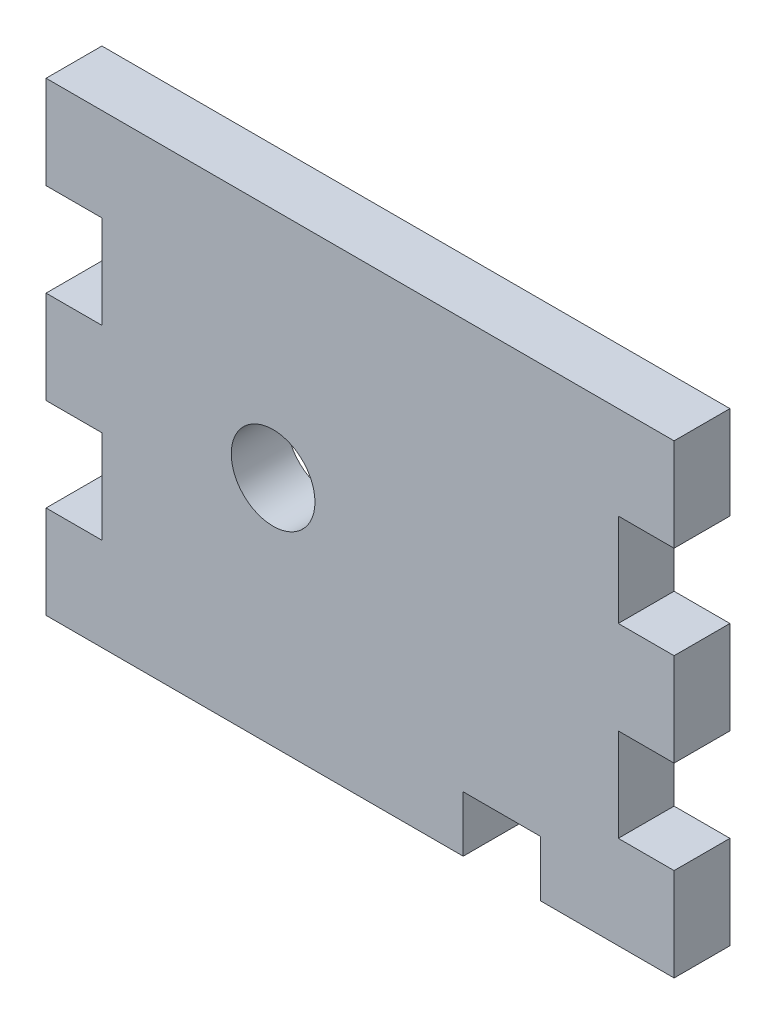
ISO-10303-21;
HEADER;
FILE_DESCRIPTION(('STEP AP214'),'2;1');
FILE_NAME('part.step','',(''),(''),'','','');
FILE_SCHEMA(('AUTOMOTIVE_DESIGN { 1 0 10303 214 1 1 1 1 }'));
ENDSEC;
DATA;
#1=APPLICATION_CONTEXT('core data for automotive mechanical design processes');
#2=APPLICATION_PROTOCOL_DEFINITION('international standard','automotive_design',2000,#1);
#3=PRODUCT_CONTEXT('',#1,'mechanical');
#4=PRODUCT('Part','Part','',(#3));
#5=PRODUCT_RELATED_PRODUCT_CATEGORY('part','',(#4));
#6=PRODUCT_DEFINITION_FORMATION('','',#4);
#7=PRODUCT_DEFINITION_CONTEXT('part definition',#1,'design');
#8=PRODUCT_DEFINITION('design','',#6,#7);
#9=PRODUCT_DEFINITION_SHAPE('','',#8);
#10=(LENGTH_UNIT() NAMED_UNIT(*) SI_UNIT(.MILLI.,.METRE.));
#11=(NAMED_UNIT(*) PLANE_ANGLE_UNIT() SI_UNIT($,.RADIAN.));
#12=(NAMED_UNIT(*) SI_UNIT($,.STERADIAN.) SOLID_ANGLE_UNIT());
#13=UNCERTAINTY_MEASURE_WITH_UNIT(LENGTH_MEASURE(1.E-05),#10,'distance_accuracy_value','');
#14=(GEOMETRIC_REPRESENTATION_CONTEXT(3) GLOBAL_UNCERTAINTY_ASSIGNED_CONTEXT((#13)) GLOBAL_UNIT_ASSIGNED_CONTEXT((#10,
#11,#12)) REPRESENTATION_CONTEXT('',''));
#15=CARTESIAN_POINT('',(0.,0.,0.));
#16=DIRECTION('',(0.,0.,1.));
#17=DIRECTION('',(1.,0.,0.));
#18=AXIS2_PLACEMENT_3D('',#15,#16,#17);
#19=CARTESIAN_POINT('',(0.,0.,15.24));
#20=DIRECTION('',(0.,1.,0.));
#21=DIRECTION('',(0.,0.,1.));
#22=AXIS2_PLACEMENT_3D('',#19,#20,#21);
#23=PLANE('',#22);
#24=DIRECTION('',(1.,0.,0.));
#25=VECTOR('',#24,1.);
#26=CARTESIAN_POINT('',(0.,0.,0.));
#27=LINE('',#26,#25);
#28=CARTESIAN_POINT('',(0.,0.,0.));
#29=VERTEX_POINT('',#28);
#30=CARTESIAN_POINT('',(113.876666666667,0.,0.));
#31=VERTEX_POINT('',#30);
#32=EDGE_CURVE('E211',#29,#31,#27,.T.);
#33=ORIENTED_EDGE('',*,*,#32,.T.);
#34=DIRECTION('',(0.,0.,1.));
#35=VECTOR('',#34,1.);
#36=CARTESIAN_POINT('',(113.876666666667,0.,0.));
#37=LINE('',#36,#35);
#38=CARTESIAN_POINT('',(113.876666666667,0.,15.24));
#39=VERTEX_POINT('',#38);
#40=EDGE_CURVE('E194',#31,#39,#37,.T.);
#41=ORIENTED_EDGE('',*,*,#40,.T.);
#42=DIRECTION('',(1.,0.,0.));
#43=VECTOR('',#42,1.);
#44=CARTESIAN_POINT('',(0.,0.,15.24));
#45=LINE('',#44,#43);
#46=CARTESIAN_POINT('',(0.,0.,15.24));
#47=VERTEX_POINT('',#46);
#48=EDGE_CURVE('E360',#47,#39,#45,.T.);
#49=ORIENTED_EDGE('',*,*,#48,.F.);
#50=DIRECTION('',(0.,0.,-1.));
#51=VECTOR('',#50,1.);
#52=CARTESIAN_POINT('',(0.,0.,15.24));
#53=LINE('',#52,#51);
#54=EDGE_CURVE('E11',#47,#29,#53,.T.);
#55=ORIENTED_EDGE('',*,*,#54,.T.);
#56=EDGE_LOOP('',(#33,#41,#49,#55));
#57=FACE_BOUND('',#56,.T.);
#58=ADVANCED_FACE('F33',(#57),#23,.F.);
#59=CARTESIAN_POINT('',(0.,0.,15.24));
#60=DIRECTION('',(1.,0.,0.));
#61=DIRECTION('',(0.,0.,-1.));
#62=AXIS2_PLACEMENT_3D('',#59,#60,#61);
#63=PLANE('',#62);
#64=DIRECTION('',(0.,-1.,0.));
#65=VECTOR('',#64,1.);
#66=CARTESIAN_POINT('',(0.,0.,0.));
#67=LINE('',#66,#65);
#68=CARTESIAN_POINT('',(0.,76.2,0.));
#69=VERTEX_POINT('',#68);
#70=CARTESIAN_POINT('',(0.,50.8,0.));
#71=VERTEX_POINT('',#70);
#72=EDGE_CURVE('E403',#69,#71,#67,.T.);
#73=ORIENTED_EDGE('',*,*,#72,.T.);
#74=DIRECTION('',(0.,0.,1.));
#75=VECTOR('',#74,1.);
#76=CARTESIAN_POINT('',(0.,50.8,0.));
#77=LINE('',#76,#75);
#78=CARTESIAN_POINT('',(0.,50.8,15.24));
#79=VERTEX_POINT('',#78);
#80=EDGE_CURVE('E296',#71,#79,#77,.T.);
#81=ORIENTED_EDGE('',*,*,#80,.T.);
#82=DIRECTION('',(0.,-1.,0.));
#83=VECTOR('',#82,1.);
#84=CARTESIAN_POINT('',(0.,0.,15.24));
#85=LINE('',#84,#83);
#86=CARTESIAN_POINT('',(0.,76.2,15.24));
#87=VERTEX_POINT('',#86);
#88=EDGE_CURVE('E359',#87,#79,#85,.T.);
#89=ORIENTED_EDGE('',*,*,#88,.F.);
#90=DIRECTION('',(0.,0.,1.));
#91=VECTOR('',#90,1.);
#92=CARTESIAN_POINT('',(0.,76.2,0.));
#93=LINE('',#92,#91);
#94=EDGE_CURVE('E339',#69,#87,#93,.T.);
#95=ORIENTED_EDGE('',*,*,#94,.F.);
#96=EDGE_LOOP('',(#73,#81,#89,#95));
#97=FACE_BOUND('',#96,.T.);
#98=ADVANCED_FACE('F397',(#97),#63,.F.);
#99=CARTESIAN_POINT('',(0.,127.,0.));
#100=VERTEX_POINT('',#99);
#101=CARTESIAN_POINT('',(0.,101.6,0.));
#102=VERTEX_POINT('',#101);
#103=EDGE_CURVE('E223',#100,#102,#67,.T.);
#104=ORIENTED_EDGE('',*,*,#103,.T.);
#105=DIRECTION('',(0.,0.,1.));
#106=VECTOR('',#105,1.);
#107=CARTESIAN_POINT('',(0.,101.6,0.));
#108=LINE('',#107,#106);
#109=CARTESIAN_POINT('',(0.,101.6,15.24));
#110=VERTEX_POINT('',#109);
#111=EDGE_CURVE('E346',#102,#110,#108,.T.);
#112=ORIENTED_EDGE('',*,*,#111,.T.);
#113=CARTESIAN_POINT('',(0.,127.,15.24));
#114=VERTEX_POINT('',#113);
#115=EDGE_CURVE('E355',#114,#110,#85,.T.);
#116=ORIENTED_EDGE('',*,*,#115,.F.);
#117=DIRECTION('',(0.,0.,-1.));
#118=VECTOR('',#117,1.);
#119=CARTESIAN_POINT('',(0.,127.,15.24));
#120=LINE('',#119,#118);
#121=EDGE_CURVE('E231',#114,#100,#120,.T.);
#122=ORIENTED_EDGE('',*,*,#121,.T.);
#123=EDGE_LOOP('',(#104,#112,#116,#122));
#124=FACE_BOUND('',#123,.T.);
#125=ADVANCED_FACE('F379',(#124),#63,.F.);
#126=CARTESIAN_POINT('',(171.45,0.,15.24));
#127=DIRECTION('',(-1.,0.,0.));
#128=DIRECTION('',(0.,-1.,0.));
#129=AXIS2_PLACEMENT_3D('',#126,#127,#128);
#130=PLANE('',#129);
#131=DIRECTION('',(0.,1.,0.));
#132=VECTOR('',#131,1.);
#133=CARTESIAN_POINT('',(171.45,0.,0.));
#134=LINE('',#133,#132);
#135=CARTESIAN_POINT('',(171.45,50.8,0.));
#136=VERTEX_POINT('',#135);
#137=CARTESIAN_POINT('',(171.45,76.2,0.));
#138=VERTEX_POINT('',#137);
#139=EDGE_CURVE('E220',#136,#138,#134,.T.);
#140=ORIENTED_EDGE('',*,*,#139,.T.);
#141=DIRECTION('',(0.,0.,1.));
#142=VECTOR('',#141,1.);
#143=CARTESIAN_POINT('',(171.45,76.2,0.));
#144=LINE('',#143,#142);
#145=CARTESIAN_POINT('',(171.45,76.2,15.24));
#146=VERTEX_POINT('',#145);
#147=EDGE_CURVE('E292',#138,#146,#144,.T.);
#148=ORIENTED_EDGE('',*,*,#147,.T.);
#149=DIRECTION('',(0.,1.,0.));
#150=VECTOR('',#149,1.);
#151=CARTESIAN_POINT('',(171.45,0.,15.24));
#152=LINE('',#151,#150);
#153=CARTESIAN_POINT('',(171.45,50.8,15.24));
#154=VERTEX_POINT('',#153);
#155=EDGE_CURVE('E363',#154,#146,#152,.T.);
#156=ORIENTED_EDGE('',*,*,#155,.F.);
#157=DIRECTION('',(0.,0.,1.));
#158=VECTOR('',#157,1.);
#159=CARTESIAN_POINT('',(171.45,50.8,0.));
#160=LINE('',#159,#158);
#161=EDGE_CURVE('E256',#136,#154,#160,.T.);
#162=ORIENTED_EDGE('',*,*,#161,.F.);
#163=EDGE_LOOP('',(#140,#148,#156,#162));
#164=FACE_BOUND('',#163,.T.);
#165=ADVANCED_FACE('F434',(#164),#130,.F.);
#166=CARTESIAN_POINT('',(171.45,0.,0.));
#167=VERTEX_POINT('',#166);
#168=CARTESIAN_POINT('',(171.45,25.4,0.));
#169=VERTEX_POINT('',#168);
#170=EDGE_CURVE('E222',#167,#169,#134,.T.);
#171=ORIENTED_EDGE('',*,*,#170,.T.);
#172=DIRECTION('',(0.,0.,1.));
#173=VECTOR('',#172,1.);
#174=CARTESIAN_POINT('',(171.45,25.4,0.));
#175=LINE('',#174,#173);
#176=CARTESIAN_POINT('',(171.45,25.4,15.24));
#177=VERTEX_POINT('',#176);
#178=EDGE_CURVE('E273',#169,#177,#175,.T.);
#179=ORIENTED_EDGE('',*,*,#178,.T.);
#180=CARTESIAN_POINT('',(171.45,0.,15.24));
#181=VERTEX_POINT('',#180);
#182=EDGE_CURVE('E245',#181,#177,#152,.T.);
#183=ORIENTED_EDGE('',*,*,#182,.F.);
#184=DIRECTION('',(0.,0.,-1.));
#185=VECTOR('',#184,1.);
#186=CARTESIAN_POINT('',(171.45,0.,15.24));
#187=LINE('',#186,#185);
#188=EDGE_CURVE('E41',#181,#167,#187,.T.);
#189=ORIENTED_EDGE('',*,*,#188,.T.);
#190=EDGE_LOOP('',(#171,#179,#183,#189));
#191=FACE_BOUND('',#190,.T.);
#192=ADVANCED_FACE('F242',(#191),#130,.F.);
#193=CARTESIAN_POINT('',(0.,25.4,15.24));
#194=VERTEX_POINT('',#193);
#195=EDGE_CURVE('E230',#194,#47,#85,.T.);
#196=ORIENTED_EDGE('',*,*,#195,.F.);
#197=DIRECTION('',(0.,0.,1.));
#198=VECTOR('',#197,1.);
#199=CARTESIAN_POINT('',(0.,25.4,0.));
#200=LINE('',#199,#198);
#201=CARTESIAN_POINT('',(0.,25.4,0.));
#202=VERTEX_POINT('',#201);
#203=EDGE_CURVE('E287',#202,#194,#200,.T.);
#204=ORIENTED_EDGE('',*,*,#203,.F.);
#205=EDGE_CURVE('E349',#202,#29,#67,.T.);
#206=ORIENTED_EDGE('',*,*,#205,.T.);
#207=ORIENTED_EDGE('',*,*,#54,.F.);
#208=EDGE_LOOP('',(#196,#204,#206,#207));
#209=FACE_BOUND('',#208,.T.);
#210=ADVANCED_FACE('F35',(#209),#63,.F.);
#211=CARTESIAN_POINT('',(135.043333333333,0.,15.24));
#212=VERTEX_POINT('',#211);
#213=EDGE_CURVE('E358',#212,#181,#45,.T.);
#214=ORIENTED_EDGE('',*,*,#213,.F.);
#215=DIRECTION('',(0.,0.,1.));
#216=VECTOR('',#215,1.);
#217=CARTESIAN_POINT('',(135.043333333333,0.,0.));
#218=LINE('',#217,#216);
#219=CARTESIAN_POINT('',(135.043333333333,0.,0.));
#220=VERTEX_POINT('',#219);
#221=EDGE_CURVE('E204',#220,#212,#218,.T.);
#222=ORIENTED_EDGE('',*,*,#221,.F.);
#223=EDGE_CURVE('E218',#220,#167,#27,.T.);
#224=ORIENTED_EDGE('',*,*,#223,.T.);
#225=ORIENTED_EDGE('',*,*,#188,.F.);
#226=EDGE_LOOP('',(#214,#222,#224,#225));
#227=FACE_BOUND('',#226,.T.);
#228=ADVANCED_FACE('F422',(#227),#23,.F.);
#229=CARTESIAN_POINT('',(171.45,101.6,15.24));
#230=VERTEX_POINT('',#229);
#231=CARTESIAN_POINT('',(171.45,127.,15.24));
#232=VERTEX_POINT('',#231);
#233=EDGE_CURVE('E362',#230,#232,#152,.T.);
#234=ORIENTED_EDGE('',*,*,#233,.F.);
#235=DIRECTION('',(0.,0.,1.));
#236=VECTOR('',#235,1.);
#237=CARTESIAN_POINT('',(171.45,101.6,0.));
#238=LINE('',#237,#236);
#239=CARTESIAN_POINT('',(171.45,101.6,0.));
#240=VERTEX_POINT('',#239);
#241=EDGE_CURVE('E315',#240,#230,#238,.T.);
#242=ORIENTED_EDGE('',*,*,#241,.F.);
#243=CARTESIAN_POINT('',(171.45,127.,0.));
#244=VERTEX_POINT('',#243);
#245=EDGE_CURVE('E217',#240,#244,#134,.T.);
#246=ORIENTED_EDGE('',*,*,#245,.T.);
#247=DIRECTION('',(0.,0.,-1.));
#248=VECTOR('',#247,1.);
#249=CARTESIAN_POINT('',(171.45,127.,15.24));
#250=LINE('',#249,#248);
#251=EDGE_CURVE('E234',#232,#244,#250,.T.);
#252=ORIENTED_EDGE('',*,*,#251,.F.);
#253=EDGE_LOOP('',(#234,#242,#246,#252));
#254=FACE_BOUND('',#253,.T.);
#255=ADVANCED_FACE('F428',(#254),#130,.F.);
#256=CARTESIAN_POINT('',(0.,127.,15.24));
#257=DIRECTION('',(0.,-1.,0.));
#258=DIRECTION('',(0.,0.,-1.));
#259=AXIS2_PLACEMENT_3D('',#256,#257,#258);
#260=PLANE('',#259);
#261=DIRECTION('',(-1.,0.,0.));
#262=VECTOR('',#261,1.);
#263=CARTESIAN_POINT('',(0.,127.,0.));
#264=LINE('',#263,#262);
#265=EDGE_CURVE('E228',#244,#100,#264,.T.);
#266=ORIENTED_EDGE('',*,*,#265,.T.);
#267=ORIENTED_EDGE('',*,*,#121,.F.);
#268=DIRECTION('',(-1.,0.,0.));
#269=VECTOR('',#268,1.);
#270=CARTESIAN_POINT('',(0.,127.,15.24));
#271=LINE('',#270,#269);
#272=EDGE_CURVE('E235',#232,#114,#271,.T.);
#273=ORIENTED_EDGE('',*,*,#272,.F.);
#274=ORIENTED_EDGE('',*,*,#251,.T.);
#275=EDGE_LOOP('',(#266,#267,#273,#274));
#276=FACE_BOUND('',#275,.T.);
#277=ADVANCED_FACE('F374',(#276),#260,.F.);
#278=CARTESIAN_POINT('',(0.,0.,15.24));
#279=DIRECTION('',(0.,0.,-1.));
#280=DIRECTION('',(-1.,0.,0.));
#281=AXIS2_PLACEMENT_3D('',#278,#279,#280);
#282=PLANE('',#281);
#283=CARTESIAN_POINT('',(61.976,63.5,15.24));
#284=DIRECTION('',(0.,0.,1.));
#285=DIRECTION('',(1.,0.,0.));
#286=AXIS2_PLACEMENT_3D('',#283,#284,#285);
#287=CIRCLE('',#286,11.43);
#288=CARTESIAN_POINT('',(73.406,63.5,15.24));
#289=VERTEX_POINT('',#288);
#290=EDGE_CURVE('E450',#289,#289,#287,.T.);
#291=ORIENTED_EDGE('',*,*,#290,.F.);
#292=EDGE_LOOP('',(#291));
#293=FACE_BOUND('',#292,.T.);
#294=ORIENTED_EDGE('',*,*,#48,.T.);
#295=DIRECTION('',(0.,-1.,0.));
#296=VECTOR('',#295,1.);
#297=CARTESIAN_POINT('',(113.876666666667,0.,15.24));
#298=LINE('',#297,#296);
#299=CARTESIAN_POINT('',(113.876666666667,15.24,15.24));
#300=VERTEX_POINT('',#299);
#301=EDGE_CURVE('E199',#300,#39,#298,.T.);
#302=ORIENTED_EDGE('',*,*,#301,.F.);
#303=DIRECTION('',(-1.,0.,0.));
#304=VECTOR('',#303,1.);
#305=CARTESIAN_POINT('',(113.876666666667,15.24,15.24));
#306=LINE('',#305,#304);
#307=CARTESIAN_POINT('',(135.043333333333,15.24,15.24));
#308=VERTEX_POINT('',#307);
#309=EDGE_CURVE('E214',#308,#300,#306,.T.);
#310=ORIENTED_EDGE('',*,*,#309,.F.);
#311=DIRECTION('',(0.,1.,0.));
#312=VECTOR('',#311,1.);
#313=CARTESIAN_POINT('',(135.043333333333,0.,15.24));
#314=LINE('',#313,#312);
#315=EDGE_CURVE('E440',#212,#308,#314,.T.);
#316=ORIENTED_EDGE('',*,*,#315,.F.);
#317=ORIENTED_EDGE('',*,*,#213,.T.);
#318=ORIENTED_EDGE('',*,*,#182,.T.);
#319=DIRECTION('',(1.,0.,0.));
#320=VECTOR('',#319,1.);
#321=CARTESIAN_POINT('',(171.45,25.4,15.24));
#322=LINE('',#321,#320);
#323=CARTESIAN_POINT('',(156.21,25.4,15.24));
#324=VERTEX_POINT('',#323);
#325=EDGE_CURVE('E271',#324,#177,#322,.T.);
#326=ORIENTED_EDGE('',*,*,#325,.F.);
#327=DIRECTION('',(0.,-1.,0.));
#328=VECTOR('',#327,1.);
#329=CARTESIAN_POINT('',(156.21,50.8,15.24));
#330=LINE('',#329,#328);
#331=CARTESIAN_POINT('',(156.21,50.8,15.24));
#332=VERTEX_POINT('',#331);
#333=EDGE_CURVE('E267',#332,#324,#330,.T.);
#334=ORIENTED_EDGE('',*,*,#333,.F.);
#335=DIRECTION('',(-1.,0.,0.));
#336=VECTOR('',#335,1.);
#337=CARTESIAN_POINT('',(171.45,50.8,15.24));
#338=LINE('',#337,#336);
#339=EDGE_CURVE('E264',#154,#332,#338,.T.);
#340=ORIENTED_EDGE('',*,*,#339,.F.);
#341=ORIENTED_EDGE('',*,*,#155,.T.);
#342=DIRECTION('',(1.,0.,0.));
#343=VECTOR('',#342,1.);
#344=CARTESIAN_POINT('',(171.45,76.2,15.24));
#345=LINE('',#344,#343);
#346=CARTESIAN_POINT('',(156.21,76.2,15.24));
#347=VERTEX_POINT('',#346);
#348=EDGE_CURVE('E309',#347,#146,#345,.T.);
#349=ORIENTED_EDGE('',*,*,#348,.F.);
#350=DIRECTION('',(0.,-1.,0.));
#351=VECTOR('',#350,1.);
#352=CARTESIAN_POINT('',(156.21,101.6,15.24));
#353=LINE('',#352,#351);
#354=CARTESIAN_POINT('',(156.21,101.6,15.24));
#355=VERTEX_POINT('',#354);
#356=EDGE_CURVE('E318',#355,#347,#353,.T.);
#357=ORIENTED_EDGE('',*,*,#356,.F.);
#358=DIRECTION('',(-1.,0.,0.));
#359=VECTOR('',#358,1.);
#360=CARTESIAN_POINT('',(171.45,101.6,15.24));
#361=LINE('',#360,#359);
#362=EDGE_CURVE('E275',#230,#355,#361,.T.);
#363=ORIENTED_EDGE('',*,*,#362,.F.);
#364=ORIENTED_EDGE('',*,*,#233,.T.);
#365=ORIENTED_EDGE('',*,*,#272,.T.);
#366=ORIENTED_EDGE('',*,*,#115,.T.);
#367=DIRECTION('',(-1.,0.,0.));
#368=VECTOR('',#367,1.);
#369=CARTESIAN_POINT('',(0.,101.6,15.24));
#370=LINE('',#369,#368);
#371=CARTESIAN_POINT('',(15.24,101.6,15.24));
#372=VERTEX_POINT('',#371);
#373=EDGE_CURVE('E333',#372,#110,#370,.T.);
#374=ORIENTED_EDGE('',*,*,#373,.F.);
#375=DIRECTION('',(0.,1.,0.));
#376=VECTOR('',#375,1.);
#377=CARTESIAN_POINT('',(15.24,101.6,15.24));
#378=LINE('',#377,#376);
#379=CARTESIAN_POINT('',(15.24,76.2,15.24));
#380=VERTEX_POINT('',#379);
#381=EDGE_CURVE('E342',#380,#372,#378,.T.);
#382=ORIENTED_EDGE('',*,*,#381,.F.);
#383=DIRECTION('',(1.,0.,0.));
#384=VECTOR('',#383,1.);
#385=CARTESIAN_POINT('',(0.,76.2,15.24));
#386=LINE('',#385,#384);
#387=EDGE_CURVE('E299',#87,#380,#386,.T.);
#388=ORIENTED_EDGE('',*,*,#387,.F.);
#389=ORIENTED_EDGE('',*,*,#88,.T.);
#390=DIRECTION('',(-1.,0.,0.));
#391=VECTOR('',#390,1.);
#392=CARTESIAN_POINT('',(0.,50.8,15.24));
#393=LINE('',#392,#391);
#394=CARTESIAN_POINT('',(15.24,50.8,15.24));
#395=VERTEX_POINT('',#394);
#396=EDGE_CURVE('E282',#395,#79,#393,.T.);
#397=ORIENTED_EDGE('',*,*,#396,.F.);
#398=DIRECTION('',(0.,1.,0.));
#399=VECTOR('',#398,1.);
#400=CARTESIAN_POINT('',(15.24,50.8,15.24));
#401=LINE('',#400,#399);
#402=CARTESIAN_POINT('',(15.24,25.4,15.24));
#403=VERTEX_POINT('',#402);
#404=EDGE_CURVE('E291',#403,#395,#401,.T.);
#405=ORIENTED_EDGE('',*,*,#404,.F.);
#406=DIRECTION('',(1.,0.,0.));
#407=VECTOR('',#406,1.);
#408=CARTESIAN_POINT('',(0.,25.4,15.24));
#409=LINE('',#408,#407);
#410=EDGE_CURVE('E288',#194,#403,#409,.T.);
#411=ORIENTED_EDGE('',*,*,#410,.F.);
#412=ORIENTED_EDGE('',*,*,#195,.T.);
#413=EDGE_LOOP('',(#294,#302,#310,#316,#317,#318,#326,#334,#340,#341,#349,#357,#363,#364,#365,
#366,#374,#382,#388,#389,#397,#405,#411,#412));
#414=FACE_BOUND('',#413,.T.);
#415=ADVANCED_FACE('F367',(#293,#414),#282,.F.);
#416=CARTESIAN_POINT('',(0.,0.,0.));
#417=DIRECTION('',(0.,0.,-1.));
#418=DIRECTION('',(-1.,0.,0.));
#419=AXIS2_PLACEMENT_3D('',#416,#417,#418);
#420=PLANE('',#419);
#421=DIRECTION('',(0.,-1.,0.));
#422=VECTOR('',#421,1.);
#423=CARTESIAN_POINT('',(113.876666666667,0.,0.));
#424=LINE('',#423,#422);
#425=CARTESIAN_POINT('',(113.876666666667,15.24,0.));
#426=VERTEX_POINT('',#425);
#427=EDGE_CURVE('E197',#426,#31,#424,.T.);
#428=ORIENTED_EDGE('',*,*,#427,.T.);
#429=ORIENTED_EDGE('',*,*,#32,.F.);
#430=ORIENTED_EDGE('',*,*,#205,.F.);
#431=DIRECTION('',(1.,0.,0.));
#432=VECTOR('',#431,1.);
#433=CARTESIAN_POINT('',(0.,25.4,0.));
#434=LINE('',#433,#432);
#435=CARTESIAN_POINT('',(15.24,25.4,0.));
#436=VERTEX_POINT('',#435);
#437=EDGE_CURVE('E279',#202,#436,#434,.T.);
#438=ORIENTED_EDGE('',*,*,#437,.T.);
#439=DIRECTION('',(0.,1.,0.));
#440=VECTOR('',#439,1.);
#441=CARTESIAN_POINT('',(15.24,50.8,0.));
#442=LINE('',#441,#440);
#443=CARTESIAN_POINT('',(15.24,50.8,0.));
#444=VERTEX_POINT('',#443);
#445=EDGE_CURVE('E56',#436,#444,#442,.T.);
#446=ORIENTED_EDGE('',*,*,#445,.T.);
#447=DIRECTION('',(-1.,0.,0.));
#448=VECTOR('',#447,1.);
#449=CARTESIAN_POINT('',(0.,50.8,0.));
#450=LINE('',#449,#448);
#451=EDGE_CURVE('E284',#444,#71,#450,.T.);
#452=ORIENTED_EDGE('',*,*,#451,.T.);
#453=ORIENTED_EDGE('',*,*,#72,.F.);
#454=DIRECTION('',(1.,0.,0.));
#455=VECTOR('',#454,1.);
#456=CARTESIAN_POINT('',(0.,76.2,0.));
#457=LINE('',#456,#455);
#458=CARTESIAN_POINT('',(15.24,76.2,0.));
#459=VERTEX_POINT('',#458);
#460=EDGE_CURVE('E329',#69,#459,#457,.T.);
#461=ORIENTED_EDGE('',*,*,#460,.T.);
#462=DIRECTION('',(0.,1.,0.));
#463=VECTOR('',#462,1.);
#464=CARTESIAN_POINT('',(15.24,101.6,0.));
#465=LINE('',#464,#463);
#466=CARTESIAN_POINT('',(15.24,101.6,0.));
#467=VERTEX_POINT('',#466);
#468=EDGE_CURVE('E332',#459,#467,#465,.T.);
#469=ORIENTED_EDGE('',*,*,#468,.T.);
#470=DIRECTION('',(-1.,0.,0.));
#471=VECTOR('',#470,1.);
#472=CARTESIAN_POINT('',(0.,101.6,0.));
#473=LINE('',#472,#471);
#474=EDGE_CURVE('E336',#467,#102,#473,.T.);
#475=ORIENTED_EDGE('',*,*,#474,.T.);
#476=ORIENTED_EDGE('',*,*,#103,.F.);
#477=ORIENTED_EDGE('',*,*,#265,.F.);
#478=ORIENTED_EDGE('',*,*,#245,.F.);
#479=DIRECTION('',(-1.,0.,0.));
#480=VECTOR('',#479,1.);
#481=CARTESIAN_POINT('',(171.45,101.6,0.));
#482=LINE('',#481,#480);
#483=CARTESIAN_POINT('',(156.21,101.6,0.));
#484=VERTEX_POINT('',#483);
#485=EDGE_CURVE('E305',#240,#484,#482,.T.);
#486=ORIENTED_EDGE('',*,*,#485,.T.);
#487=DIRECTION('',(0.,-1.,0.));
#488=VECTOR('',#487,1.);
#489=CARTESIAN_POINT('',(156.21,101.6,0.));
#490=LINE('',#489,#488);
#491=CARTESIAN_POINT('',(156.21,76.2,0.));
#492=VERTEX_POINT('',#491);
#493=EDGE_CURVE('E308',#484,#492,#490,.T.);
#494=ORIENTED_EDGE('',*,*,#493,.T.);
#495=DIRECTION('',(1.,0.,0.));
#496=VECTOR('',#495,1.);
#497=CARTESIAN_POINT('',(171.45,76.2,0.));
#498=LINE('',#497,#496);
#499=EDGE_CURVE('E312',#492,#138,#498,.T.);
#500=ORIENTED_EDGE('',*,*,#499,.T.);
#501=ORIENTED_EDGE('',*,*,#139,.F.);
#502=DIRECTION('',(-1.,0.,0.));
#503=VECTOR('',#502,1.);
#504=CARTESIAN_POINT('',(171.45,50.8,0.));
#505=LINE('',#504,#503);
#506=CARTESIAN_POINT('',(156.21,50.8,0.));
#507=VERTEX_POINT('',#506);
#508=EDGE_CURVE('E260',#136,#507,#505,.T.);
#509=ORIENTED_EDGE('',*,*,#508,.T.);
#510=DIRECTION('',(0.,-1.,0.));
#511=VECTOR('',#510,1.);
#512=CARTESIAN_POINT('',(156.21,50.8,0.));
#513=LINE('',#512,#511);
#514=CARTESIAN_POINT('',(156.21,25.4,0.));
#515=VERTEX_POINT('',#514);
#516=EDGE_CURVE('E254',#507,#515,#513,.T.);
#517=ORIENTED_EDGE('',*,*,#516,.T.);
#518=DIRECTION('',(1.,0.,0.));
#519=VECTOR('',#518,1.);
#520=CARTESIAN_POINT('',(171.45,25.4,0.));
#521=LINE('',#520,#519);
#522=EDGE_CURVE('E252',#515,#169,#521,.T.);
#523=ORIENTED_EDGE('',*,*,#522,.T.);
#524=ORIENTED_EDGE('',*,*,#170,.F.);
#525=ORIENTED_EDGE('',*,*,#223,.F.);
#526=DIRECTION('',(0.,1.,0.));
#527=VECTOR('',#526,1.);
#528=CARTESIAN_POINT('',(135.043333333333,0.,0.));
#529=LINE('',#528,#527);
#530=CARTESIAN_POINT('',(135.043333333333,15.24,0.));
#531=VERTEX_POINT('',#530);
#532=EDGE_CURVE('E213',#220,#531,#529,.T.);
#533=ORIENTED_EDGE('',*,*,#532,.T.);
#534=DIRECTION('',(-1.,0.,0.));
#535=VECTOR('',#534,1.);
#536=CARTESIAN_POINT('',(113.876666666667,15.24,0.));
#537=LINE('',#536,#535);
#538=EDGE_CURVE('E48',#531,#426,#537,.T.);
#539=ORIENTED_EDGE('',*,*,#538,.T.);
#540=EDGE_LOOP('',(#428,#429,#430,#438,#446,#452,#453,#461,#469,#475,#476,#477,#478,#486,#494,
#500,#501,#509,#517,#523,#524,#525,#533,#539));
#541=FACE_BOUND('',#540,.T.);
#542=CARTESIAN_POINT('',(61.976,63.5,0.));
#543=DIRECTION('',(0.,0.,1.));
#544=DIRECTION('',(1.,0.,0.));
#545=AXIS2_PLACEMENT_3D('',#542,#543,#544);
#546=CIRCLE('',#545,11.43);
#547=CARTESIAN_POINT('',(73.406,63.5,0.));
#548=VERTEX_POINT('',#547);
#549=EDGE_CURVE('E268',#548,#548,#546,.T.);
#550=ORIENTED_EDGE('',*,*,#549,.T.);
#551=EDGE_LOOP('',(#550));
#552=FACE_BOUND('',#551,.T.);
#553=ADVANCED_FACE('F208',(#541,#552),#420,.T.);
#554=CARTESIAN_POINT('',(0.,101.6,0.));
#555=DIRECTION('',(0.,1.,0.));
#556=DIRECTION('',(0.,0.,1.));
#557=AXIS2_PLACEMENT_3D('',#554,#555,#556);
#558=PLANE('',#557);
#559=ORIENTED_EDGE('',*,*,#373,.T.);
#560=ORIENTED_EDGE('',*,*,#111,.F.);
#561=ORIENTED_EDGE('',*,*,#474,.F.);
#562=DIRECTION('',(0.,0.,1.));
#563=VECTOR('',#562,1.);
#564=CARTESIAN_POINT('',(15.24,101.6,0.));
#565=LINE('',#564,#563);
#566=EDGE_CURVE('E350',#467,#372,#565,.T.);
#567=ORIENTED_EDGE('',*,*,#566,.T.);
#568=EDGE_LOOP('',(#559,#560,#561,#567));
#569=FACE_BOUND('',#568,.T.);
#570=ADVANCED_FACE('F382',(#569),#558,.F.);
#571=CARTESIAN_POINT('',(15.24,101.6,0.));
#572=DIRECTION('',(1.,0.,0.));
#573=DIRECTION('',(0.,0.,-1.));
#574=AXIS2_PLACEMENT_3D('',#571,#572,#573);
#575=PLANE('',#574);
#576=ORIENTED_EDGE('',*,*,#381,.T.);
#577=ORIENTED_EDGE('',*,*,#566,.F.);
#578=ORIENTED_EDGE('',*,*,#468,.F.);
#579=DIRECTION('',(0.,0.,1.));
#580=VECTOR('',#579,1.);
#581=CARTESIAN_POINT('',(15.24,76.2,0.));
#582=LINE('',#581,#580);
#583=EDGE_CURVE('E352',#459,#380,#582,.T.);
#584=ORIENTED_EDGE('',*,*,#583,.T.);
#585=EDGE_LOOP('',(#576,#577,#578,#584));
#586=FACE_BOUND('',#585,.T.);
#587=ADVANCED_FACE('F386',(#586),#575,.F.);
#588=CARTESIAN_POINT('',(0.,76.2,0.));
#589=DIRECTION('',(0.,-1.,0.));
#590=DIRECTION('',(0.,0.,-1.));
#591=AXIS2_PLACEMENT_3D('',#588,#589,#590);
#592=PLANE('',#591);
#593=ORIENTED_EDGE('',*,*,#387,.T.);
#594=ORIENTED_EDGE('',*,*,#583,.F.);
#595=ORIENTED_EDGE('',*,*,#460,.F.);
#596=ORIENTED_EDGE('',*,*,#94,.T.);
#597=EDGE_LOOP('',(#593,#594,#595,#596));
#598=FACE_BOUND('',#597,.T.);
#599=ADVANCED_FACE('F388',(#598),#592,.F.);
#600=CARTESIAN_POINT('',(171.45,25.4,0.));
#601=DIRECTION('',(0.,-1.,0.));
#602=DIRECTION('',(1.,0.,0.));
#603=AXIS2_PLACEMENT_3D('',#600,#601,#602);
#604=PLANE('',#603);
#605=ORIENTED_EDGE('',*,*,#325,.T.);
#606=ORIENTED_EDGE('',*,*,#178,.F.);
#607=ORIENTED_EDGE('',*,*,#522,.F.);
#608=DIRECTION('',(0.,0.,1.));
#609=VECTOR('',#608,1.);
#610=CARTESIAN_POINT('',(156.21,25.4,0.));
#611=LINE('',#610,#609);
#612=EDGE_CURVE('E276',#515,#324,#611,.T.);
#613=ORIENTED_EDGE('',*,*,#612,.T.);
#614=EDGE_LOOP('',(#605,#606,#607,#613));
#615=FACE_BOUND('',#614,.T.);
#616=ADVANCED_FACE('F472',(#615),#604,.F.);
#617=CARTESIAN_POINT('',(156.21,50.8,0.));
#618=DIRECTION('',(-1.,0.,0.));
#619=DIRECTION('',(0.,0.,1.));
#620=AXIS2_PLACEMENT_3D('',#617,#618,#619);
#621=PLANE('',#620);
#622=ORIENTED_EDGE('',*,*,#333,.T.);
#623=ORIENTED_EDGE('',*,*,#612,.F.);
#624=ORIENTED_EDGE('',*,*,#516,.F.);
#625=DIRECTION('',(0.,0.,1.));
#626=VECTOR('',#625,1.);
#627=CARTESIAN_POINT('',(156.21,50.8,0.));
#628=LINE('',#627,#626);
#629=EDGE_CURVE('E258',#507,#332,#628,.T.);
#630=ORIENTED_EDGE('',*,*,#629,.T.);
#631=EDGE_LOOP('',(#622,#623,#624,#630));
#632=FACE_BOUND('',#631,.T.);
#633=ADVANCED_FACE('F471',(#632),#621,.F.);
#634=CARTESIAN_POINT('',(171.45,50.8,0.));
#635=DIRECTION('',(0.,1.,0.));
#636=DIRECTION('',(0.,0.,1.));
#637=AXIS2_PLACEMENT_3D('',#634,#635,#636);
#638=PLANE('',#637);
#639=ORIENTED_EDGE('',*,*,#339,.T.);
#640=ORIENTED_EDGE('',*,*,#629,.F.);
#641=ORIENTED_EDGE('',*,*,#508,.F.);
#642=ORIENTED_EDGE('',*,*,#161,.T.);
#643=EDGE_LOOP('',(#639,#640,#641,#642));
#644=FACE_BOUND('',#643,.T.);
#645=ADVANCED_FACE('F462',(#644),#638,.F.);
#646=CARTESIAN_POINT('',(171.45,76.2,0.));
#647=DIRECTION('',(0.,-1.,0.));
#648=DIRECTION('',(1.,0.,0.));
#649=AXIS2_PLACEMENT_3D('',#646,#647,#648);
#650=PLANE('',#649);
#651=ORIENTED_EDGE('',*,*,#348,.T.);
#652=ORIENTED_EDGE('',*,*,#147,.F.);
#653=ORIENTED_EDGE('',*,*,#499,.F.);
#654=DIRECTION('',(0.,0.,1.));
#655=VECTOR('',#654,1.);
#656=CARTESIAN_POINT('',(156.21,76.2,0.));
#657=LINE('',#656,#655);
#658=EDGE_CURVE('E324',#492,#347,#657,.T.);
#659=ORIENTED_EDGE('',*,*,#658,.T.);
#660=EDGE_LOOP('',(#651,#652,#653,#659));
#661=FACE_BOUND('',#660,.T.);
#662=ADVANCED_FACE('F485',(#661),#650,.F.);
#663=CARTESIAN_POINT('',(156.21,101.6,0.));
#664=DIRECTION('',(-1.,0.,0.));
#665=DIRECTION('',(0.,0.,1.));
#666=AXIS2_PLACEMENT_3D('',#663,#664,#665);
#667=PLANE('',#666);
#668=ORIENTED_EDGE('',*,*,#356,.T.);
#669=ORIENTED_EDGE('',*,*,#658,.F.);
#670=ORIENTED_EDGE('',*,*,#493,.F.);
#671=DIRECTION('',(0.,0.,1.));
#672=VECTOR('',#671,1.);
#673=CARTESIAN_POINT('',(156.21,101.6,0.));
#674=LINE('',#673,#672);
#675=EDGE_CURVE('E326',#484,#355,#674,.T.);
#676=ORIENTED_EDGE('',*,*,#675,.T.);
#677=EDGE_LOOP('',(#668,#669,#670,#676));
#678=FACE_BOUND('',#677,.T.);
#679=ADVANCED_FACE('F491',(#678),#667,.F.);
#680=CARTESIAN_POINT('',(171.45,101.6,0.));
#681=DIRECTION('',(0.,1.,0.));
#682=DIRECTION('',(-1.,0.,0.));
#683=AXIS2_PLACEMENT_3D('',#680,#681,#682);
#684=PLANE('',#683);
#685=ORIENTED_EDGE('',*,*,#362,.T.);
#686=ORIENTED_EDGE('',*,*,#675,.F.);
#687=ORIENTED_EDGE('',*,*,#485,.F.);
#688=ORIENTED_EDGE('',*,*,#241,.T.);
#689=EDGE_LOOP('',(#685,#686,#687,#688));
#690=FACE_BOUND('',#689,.T.);
#691=ADVANCED_FACE('F487',(#690),#684,.F.);
#692=CARTESIAN_POINT('',(0.,50.8,0.));
#693=DIRECTION('',(0.,1.,0.));
#694=DIRECTION('',(0.,0.,1.));
#695=AXIS2_PLACEMENT_3D('',#692,#693,#694);
#696=PLANE('',#695);
#697=ORIENTED_EDGE('',*,*,#396,.T.);
#698=ORIENTED_EDGE('',*,*,#80,.F.);
#699=ORIENTED_EDGE('',*,*,#451,.F.);
#700=DIRECTION('',(0.,0.,1.));
#701=VECTOR('',#700,1.);
#702=CARTESIAN_POINT('',(15.24,50.8,0.));
#703=LINE('',#702,#701);
#704=EDGE_CURVE('E300',#444,#395,#703,.T.);
#705=ORIENTED_EDGE('',*,*,#704,.T.);
#706=EDGE_LOOP('',(#697,#698,#699,#705));
#707=FACE_BOUND('',#706,.T.);
#708=ADVANCED_FACE('F406',(#707),#696,.F.);
#709=CARTESIAN_POINT('',(15.24,50.8,0.));
#710=DIRECTION('',(1.,0.,0.));
#711=DIRECTION('',(0.,0.,-1.));
#712=AXIS2_PLACEMENT_3D('',#709,#710,#711);
#713=PLANE('',#712);
#714=ORIENTED_EDGE('',*,*,#404,.T.);
#715=ORIENTED_EDGE('',*,*,#704,.F.);
#716=ORIENTED_EDGE('',*,*,#445,.F.);
#717=DIRECTION('',(0.,0.,1.));
#718=VECTOR('',#717,1.);
#719=CARTESIAN_POINT('',(15.24,25.4,0.));
#720=LINE('',#719,#718);
#721=EDGE_CURVE('E302',#436,#403,#720,.T.);
#722=ORIENTED_EDGE('',*,*,#721,.T.);
#723=EDGE_LOOP('',(#714,#715,#716,#722));
#724=FACE_BOUND('',#723,.T.);
#725=ADVANCED_FACE('F407',(#724),#713,.F.);
#726=CARTESIAN_POINT('',(0.,25.4,0.));
#727=DIRECTION('',(0.,-1.,0.));
#728=DIRECTION('',(0.,0.,-1.));
#729=AXIS2_PLACEMENT_3D('',#726,#727,#728);
#730=PLANE('',#729);
#731=ORIENTED_EDGE('',*,*,#410,.T.);
#732=ORIENTED_EDGE('',*,*,#721,.F.);
#733=ORIENTED_EDGE('',*,*,#437,.F.);
#734=ORIENTED_EDGE('',*,*,#203,.T.);
#735=EDGE_LOOP('',(#731,#732,#733,#734));
#736=FACE_BOUND('',#735,.T.);
#737=ADVANCED_FACE('F409',(#736),#730,.F.);
#738=CARTESIAN_POINT('',(61.976,63.5,0.));
#739=DIRECTION('',(0.,0.,1.));
#740=DIRECTION('',(1.,0.,0.));
#741=AXIS2_PLACEMENT_3D('',#738,#739,#740);
#742=CYLINDRICAL_SURFACE('',#741,11.43);
#743=CARTESIAN_POINT('',(73.406,63.5,0.));
#744=CARTESIAN_POINT('',(73.406,63.5,0.15875));
#745=CARTESIAN_POINT('',(73.406,63.5,0.3175));
#746=CARTESIAN_POINT('',(73.406,63.5,0.635));
#747=CARTESIAN_POINT('',(73.406,63.5,0.79375));
#748=CARTESIAN_POINT('',(73.406,63.5,1.11125));
#749=CARTESIAN_POINT('',(73.406,63.5,1.27));
#750=CARTESIAN_POINT('',(73.406,63.5,1.5875));
#751=CARTESIAN_POINT('',(73.406,63.5,1.74625));
#752=CARTESIAN_POINT('',(73.406,63.5,2.06375));
#753=CARTESIAN_POINT('',(73.406,63.5,2.2225));
#754=CARTESIAN_POINT('',(73.406,63.5,2.54));
#755=CARTESIAN_POINT('',(73.406,63.5,2.69875));
#756=CARTESIAN_POINT('',(73.406,63.5,3.01625));
#757=CARTESIAN_POINT('',(73.406,63.5,3.175));
#758=CARTESIAN_POINT('',(73.406,63.5,3.4925));
#759=CARTESIAN_POINT('',(73.406,63.5,3.65125));
#760=CARTESIAN_POINT('',(73.406,63.5,3.96875));
#761=CARTESIAN_POINT('',(73.406,63.5,4.1275));
#762=CARTESIAN_POINT('',(73.406,63.5,4.445));
#763=CARTESIAN_POINT('',(73.406,63.5,4.60375));
#764=CARTESIAN_POINT('',(73.406,63.5,4.92125));
#765=CARTESIAN_POINT('',(73.406,63.5,5.08));
#766=CARTESIAN_POINT('',(73.406,63.5,5.3975));
#767=CARTESIAN_POINT('',(73.406,63.5,5.55625));
#768=CARTESIAN_POINT('',(73.406,63.5,5.87375));
#769=CARTESIAN_POINT('',(73.406,63.5,6.0325));
#770=CARTESIAN_POINT('',(73.406,63.5,6.35));
#771=CARTESIAN_POINT('',(73.406,63.5,6.50875));
#772=CARTESIAN_POINT('',(73.406,63.5,6.82625));
#773=CARTESIAN_POINT('',(73.406,63.5,6.985));
#774=CARTESIAN_POINT('',(73.406,63.5,7.3025));
#775=CARTESIAN_POINT('',(73.406,63.5,7.46125));
#776=CARTESIAN_POINT('',(73.406,63.5,7.77875));
#777=CARTESIAN_POINT('',(73.406,63.5,7.9375));
#778=CARTESIAN_POINT('',(73.406,63.5,8.255));
#779=CARTESIAN_POINT('',(73.406,63.5,8.41375));
#780=CARTESIAN_POINT('',(73.406,63.5,8.73125));
#781=CARTESIAN_POINT('',(73.406,63.5,8.89));
#782=CARTESIAN_POINT('',(73.406,63.5,9.2075));
#783=CARTESIAN_POINT('',(73.406,63.5,9.36625));
#784=CARTESIAN_POINT('',(73.406,63.5,9.68375));
#785=CARTESIAN_POINT('',(73.406,63.5,9.8425));
#786=CARTESIAN_POINT('',(73.406,63.5,10.16));
#787=CARTESIAN_POINT('',(73.406,63.5,10.31875));
#788=CARTESIAN_POINT('',(73.406,63.5,10.63625));
#789=CARTESIAN_POINT('',(73.406,63.5,10.795));
#790=CARTESIAN_POINT('',(73.406,63.5,11.1125));
#791=CARTESIAN_POINT('',(73.406,63.5,11.27125));
#792=CARTESIAN_POINT('',(73.406,63.5,11.58875));
#793=CARTESIAN_POINT('',(73.406,63.5,11.7475));
#794=CARTESIAN_POINT('',(73.406,63.5,12.065));
#795=CARTESIAN_POINT('',(73.406,63.5,12.22375));
#796=CARTESIAN_POINT('',(73.406,63.5,12.54125));
#797=CARTESIAN_POINT('',(73.406,63.5,12.7));
#798=CARTESIAN_POINT('',(73.406,63.5,13.0175));
#799=CARTESIAN_POINT('',(73.406,63.5,13.17625));
#800=CARTESIAN_POINT('',(73.406,63.5,13.49375));
#801=CARTESIAN_POINT('',(73.406,63.5,13.6525));
#802=CARTESIAN_POINT('',(73.406,63.5,13.97));
#803=CARTESIAN_POINT('',(73.406,63.5,14.12875));
#804=CARTESIAN_POINT('',(73.406,63.5,14.44625));
#805=CARTESIAN_POINT('',(73.406,63.5,14.605));
#806=CARTESIAN_POINT('',(73.406,63.5,14.9225));
#807=CARTESIAN_POINT('',(73.406,63.5,15.08125));
#808=CARTESIAN_POINT('',(73.406,63.5,15.24));
#809=B_SPLINE_CURVE_WITH_KNOTS('',3,(#743,#744,#745,#746,#747,#748,#749,#750,#751,#752,#753,
#754,#755,#756,#757,#758,#759,#760,#761,#762,#763,#764,#765,#766,#767,#768,#769,#770,#771,#772,
#773,#774,#775,#776,#777,#778,#779,#780,#781,#782,#783,#784,#785,#786,#787,#788,#789,#790,#791,
#792,#793,#794,#795,#796,#797,#798,#799,#800,#801,#802,#803,#804,#805,#806,#807,#808),
.UNSPECIFIED.,.F.,.F.,(4,2,2,2,2,2,2,2,2,2,2,2,2,2,2,2,2,2,2,2,2,2,2,2,2,2,2,2,2,2,2,2,4),(0.,
0.47625,0.9525,1.42875,1.905,2.38125,2.8575,3.33375,3.81,4.28625,4.7625,5.23875,5.715,6.19125,
6.6675,7.14375,7.62,8.09625,8.5725,9.04875,9.525,10.00125,10.4775,10.95375,11.43,11.90625,
12.3825,12.85875,13.335,13.81125,14.2875,14.76375,15.24),.UNSPECIFIED.);
#810=EDGE_CURVE('BSEAM411',#548,#289,#809,.T.);
#811=ORIENTED_EDGE('',*,*,#549,.F.);
#812=ORIENTED_EDGE('',*,*,#290,.T.);
#813=ORIENTED_EDGE('',*,*,#810,.T.);
#814=ORIENTED_EDGE('',*,*,#810,.F.);
#815=EDGE_LOOP('',(#811,#813,#812,#814));
#816=FACE_BOUND('',#815,.T.);
#817=ADVANCED_FACE('F411',(#816),#742,.F.);
#818=CARTESIAN_POINT('',(113.876666666667,0.,0.));
#819=DIRECTION('',(-1.,0.,0.));
#820=DIRECTION('',(0.,0.,1.));
#821=AXIS2_PLACEMENT_3D('',#818,#819,#820);
#822=PLANE('',#821);
#823=ORIENTED_EDGE('',*,*,#301,.T.);
#824=ORIENTED_EDGE('',*,*,#40,.F.);
#825=ORIENTED_EDGE('',*,*,#427,.F.);
#826=DIRECTION('',(0.,0.,1.));
#827=VECTOR('',#826,1.);
#828=CARTESIAN_POINT('',(113.876666666667,15.24,0.));
#829=LINE('',#828,#827);
#830=EDGE_CURVE('E448',#426,#300,#829,.T.);
#831=ORIENTED_EDGE('',*,*,#830,.T.);
#832=EDGE_LOOP('',(#823,#824,#825,#831));
#833=FACE_BOUND('',#832,.T.);
#834=ADVANCED_FACE('F196',(#833),#822,.F.);
#835=CARTESIAN_POINT('',(113.876666666667,15.24,0.));
#836=DIRECTION('',(0.,1.,0.));
#837=DIRECTION('',(-1.,0.,0.));
#838=AXIS2_PLACEMENT_3D('',#835,#836,#837);
#839=PLANE('',#838);
#840=ORIENTED_EDGE('',*,*,#309,.T.);
#841=ORIENTED_EDGE('',*,*,#830,.F.);
#842=ORIENTED_EDGE('',*,*,#538,.F.);
#843=DIRECTION('',(0.,0.,1.));
#844=VECTOR('',#843,1.);
#845=CARTESIAN_POINT('',(135.043333333333,15.24,0.));
#846=LINE('',#845,#844);
#847=EDGE_CURVE('E451',#531,#308,#846,.T.);
#848=ORIENTED_EDGE('',*,*,#847,.T.);
#849=EDGE_LOOP('',(#840,#841,#842,#848));
#850=FACE_BOUND('',#849,.T.);
#851=ADVANCED_FACE('F653',(#850),#839,.F.);
#852=CARTESIAN_POINT('',(135.043333333333,0.,0.));
#853=DIRECTION('',(1.,0.,0.));
#854=DIRECTION('',(0.,1.,0.));
#855=AXIS2_PLACEMENT_3D('',#852,#853,#854);
#856=PLANE('',#855);
#857=ORIENTED_EDGE('',*,*,#315,.T.);
#858=ORIENTED_EDGE('',*,*,#847,.F.);
#859=ORIENTED_EDGE('',*,*,#532,.F.);
#860=ORIENTED_EDGE('',*,*,#221,.T.);
#861=EDGE_LOOP('',(#857,#858,#859,#860));
#862=FACE_BOUND('',#861,.T.);
#863=ADVANCED_FACE('F660',(#862),#856,.F.);
#864=CLOSED_SHELL('',(#58,#98,#125,#165,#192,#210,#228,#255,#277,#415,#553,#570,#587,#599,#616,
#633,#645,#662,#679,#691,#708,#725,#737,#817,#834,#851,#863));
#865=MANIFOLD_SOLID_BREP('B2',#864);
#866=ADVANCED_BREP_SHAPE_REPRESENTATION('',(#18,#865),#14);
#867=SHAPE_DEFINITION_REPRESENTATION(#9,#866);
ENDSEC;
END-ISO-10303-21;
